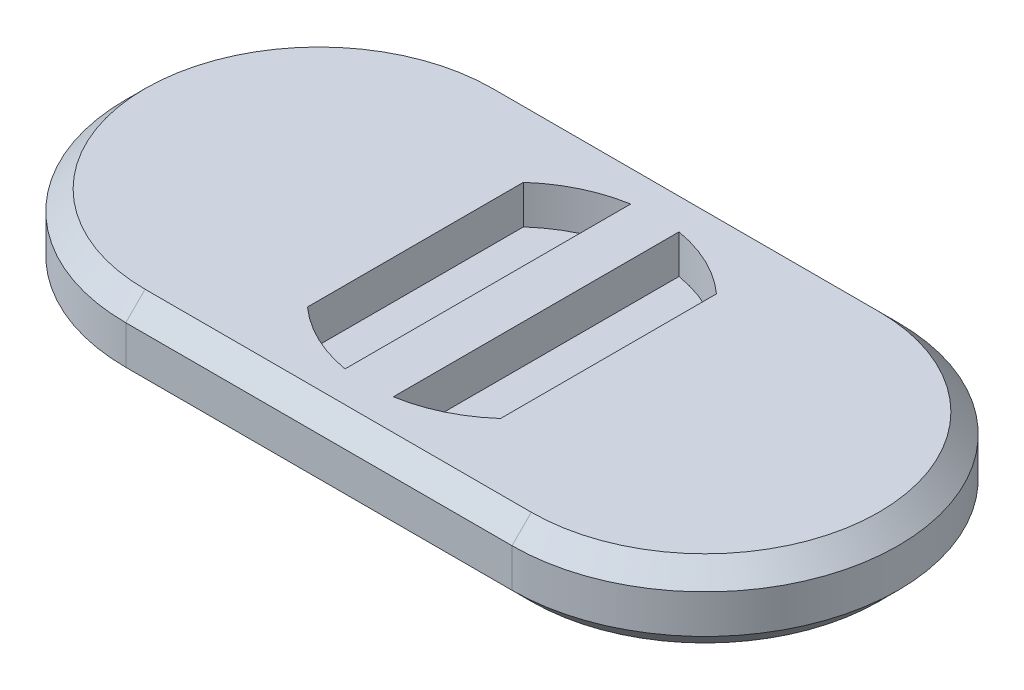
ISO-10303-21;
HEADER;
FILE_DESCRIPTION(('STEP AP214'),'2;1');
FILE_NAME('part.step','',(''),(''),'','','');
FILE_SCHEMA(('AUTOMOTIVE_DESIGN { 1 0 10303 214 1 1 1 1 }'));
ENDSEC;
DATA;
#1=APPLICATION_CONTEXT('core data for automotive mechanical design processes');
#2=APPLICATION_PROTOCOL_DEFINITION('international standard','automotive_design',2000,#1);
#3=PRODUCT_CONTEXT('',#1,'mechanical');
#4=PRODUCT('Part','Part','',(#3));
#5=PRODUCT_RELATED_PRODUCT_CATEGORY('part','',(#4));
#6=PRODUCT_DEFINITION_FORMATION('','',#4);
#7=PRODUCT_DEFINITION_CONTEXT('part definition',#1,'design');
#8=PRODUCT_DEFINITION('design','',#6,#7);
#9=PRODUCT_DEFINITION_SHAPE('','',#8);
#10=(LENGTH_UNIT() NAMED_UNIT(*) SI_UNIT(.MILLI.,.METRE.));
#11=(NAMED_UNIT(*) PLANE_ANGLE_UNIT() SI_UNIT($,.RADIAN.));
#12=(NAMED_UNIT(*) SI_UNIT($,.STERADIAN.) SOLID_ANGLE_UNIT());
#13=UNCERTAINTY_MEASURE_WITH_UNIT(LENGTH_MEASURE(1.E-05),#10,'distance_accuracy_value','');
#14=(GEOMETRIC_REPRESENTATION_CONTEXT(3) GLOBAL_UNCERTAINTY_ASSIGNED_CONTEXT((#13)) GLOBAL_UNIT_ASSIGNED_CONTEXT((#10,
#11,#12)) REPRESENTATION_CONTEXT('',''));
#15=CARTESIAN_POINT('',(0.,0.,0.));
#16=DIRECTION('',(0.,0.,1.));
#17=DIRECTION('',(1.,0.,0.));
#18=AXIS2_PLACEMENT_3D('',#15,#16,#17);
#19=CARTESIAN_POINT('',(-20.,8.,0.));
#20=DIRECTION('',(0.,-1.,0.));
#21=DIRECTION('',(0.,0.,-1.));
#22=AXIS2_PLACEMENT_3D('',#19,#20,#21);
#23=CYLINDRICAL_SURFACE('',#22,20.);
#24=DIRECTION('',(0.,-1.,0.));
#25=VECTOR('',#24,1.);
#26=CARTESIAN_POINT('',(-20.,8.,20.));
#27=LINE('',#26,#25);
#28=CARTESIAN_POINT('',(-20.,5.99999999999998,20.));
#29=VERTEX_POINT('',#28);
#30=CARTESIAN_POINT('',(-20.,2.00000000000001,20.));
#31=VERTEX_POINT('',#30);
#32=EDGE_CURVE('E275',#29,#31,#27,.T.);
#33=ORIENTED_EDGE('',*,*,#32,.F.);
#34=CARTESIAN_POINT('',(-20.,5.99999999999998,0.));
#35=DIRECTION('',(0.,1.,0.));
#36=DIRECTION('',(0.,0.,1.));
#37=AXIS2_PLACEMENT_3D('',#34,#35,#36);
#38=CIRCLE('',#37,20.);
#39=CARTESIAN_POINT('',(-20.,5.99999999999998,-20.));
#40=VERTEX_POINT('',#39);
#41=EDGE_CURVE('E296',#29,#40,#38,.F.);
#42=ORIENTED_EDGE('',*,*,#41,.T.);
#43=DIRECTION('',(0.,-1.,0.));
#44=VECTOR('',#43,1.);
#45=CARTESIAN_POINT('',(-20.,8.,-20.));
#46=LINE('',#45,#44);
#47=CARTESIAN_POINT('',(-20.,2.00000000000001,-20.));
#48=VERTEX_POINT('',#47);
#49=EDGE_CURVE('E214',#40,#48,#46,.T.);
#50=ORIENTED_EDGE('',*,*,#49,.T.);
#51=CARTESIAN_POINT('',(-20.,2.00000000000001,0.));
#52=DIRECTION('',(0.,1.,0.));
#53=DIRECTION('',(0.,0.,1.));
#54=AXIS2_PLACEMENT_3D('',#51,#52,#53);
#55=CIRCLE('',#54,20.);
#56=EDGE_CURVE('E292',#48,#31,#55,.T.);
#57=ORIENTED_EDGE('',*,*,#56,.T.);
#58=EDGE_LOOP('',(#33,#42,#50,#57));
#59=FACE_BOUND('',#58,.T.);
#60=ADVANCED_FACE('F47',(#59),#23,.T.);
#61=CARTESIAN_POINT('',(-20.,8.,20.));
#62=DIRECTION('',(0.,0.,-1.));
#63=DIRECTION('',(-1.,0.,0.));
#64=AXIS2_PLACEMENT_3D('',#61,#62,#63);
#65=PLANE('',#64);
#66=DIRECTION('',(0.,-1.,0.));
#67=VECTOR('',#66,1.);
#68=CARTESIAN_POINT('',(20.,8.,20.));
#69=LINE('',#68,#67);
#70=CARTESIAN_POINT('',(20.,5.99999999999998,20.));
#71=VERTEX_POINT('',#70);
#72=CARTESIAN_POINT('',(20.,2.00000000000001,20.));
#73=VERTEX_POINT('',#72);
#74=EDGE_CURVE('E271',#71,#73,#69,.T.);
#75=ORIENTED_EDGE('',*,*,#74,.F.);
#76=DIRECTION('',(-1.,0.,0.));
#77=VECTOR('',#76,1.);
#78=CARTESIAN_POINT('',(-20.,5.99999999999998,20.));
#79=LINE('',#78,#77);
#80=EDGE_CURVE('E303',#71,#29,#79,.T.);
#81=ORIENTED_EDGE('',*,*,#80,.T.);
#82=ORIENTED_EDGE('',*,*,#32,.T.);
#83=DIRECTION('',(1.,0.,0.));
#84=VECTOR('',#83,1.);
#85=CARTESIAN_POINT('',(-20.,2.00000000000001,20.));
#86=LINE('',#85,#84);
#87=EDGE_CURVE('E300',#31,#73,#86,.T.);
#88=ORIENTED_EDGE('',*,*,#87,.T.);
#89=EDGE_LOOP('',(#75,#81,#82,#88));
#90=FACE_BOUND('',#89,.T.);
#91=ADVANCED_FACE('F368',(#90),#65,.F.);
#92=CARTESIAN_POINT('',(20.,8.,0.));
#93=DIRECTION('',(0.,-1.,0.));
#94=DIRECTION('',(0.,0.,-1.));
#95=AXIS2_PLACEMENT_3D('',#92,#93,#94);
#96=CYLINDRICAL_SURFACE('',#95,20.);
#97=DIRECTION('',(0.,-1.,0.));
#98=VECTOR('',#97,1.);
#99=CARTESIAN_POINT('',(20.,8.,-20.));
#100=LINE('',#99,#98);
#101=CARTESIAN_POINT('',(20.,5.99999999999998,-20.));
#102=VERTEX_POINT('',#101);
#103=CARTESIAN_POINT('',(20.,2.00000000000001,-20.));
#104=VERTEX_POINT('',#103);
#105=EDGE_CURVE('E267',#102,#104,#100,.T.);
#106=ORIENTED_EDGE('',*,*,#105,.F.);
#107=CARTESIAN_POINT('',(20.,5.99999999999998,0.));
#108=DIRECTION('',(0.,1.,0.));
#109=DIRECTION('',(0.,0.,1.));
#110=AXIS2_PLACEMENT_3D('',#107,#108,#109);
#111=CIRCLE('',#110,20.);
#112=EDGE_CURVE('E315',#102,#71,#111,.F.);
#113=ORIENTED_EDGE('',*,*,#112,.T.);
#114=ORIENTED_EDGE('',*,*,#74,.T.);
#115=CARTESIAN_POINT('',(20.,2.00000000000001,0.));
#116=DIRECTION('',(0.,1.,0.));
#117=DIRECTION('',(0.,0.,1.));
#118=AXIS2_PLACEMENT_3D('',#115,#116,#117);
#119=CIRCLE('',#118,20.);
#120=EDGE_CURVE('E312',#73,#104,#119,.T.);
#121=ORIENTED_EDGE('',*,*,#120,.T.);
#122=EDGE_LOOP('',(#106,#113,#114,#121));
#123=FACE_BOUND('',#122,.T.);
#124=ADVANCED_FACE('F385',(#123),#96,.T.);
#125=CARTESIAN_POINT('',(-20.,8.,-20.));
#126=DIRECTION('',(0.,0.,1.));
#127=DIRECTION('',(1.,0.,0.));
#128=AXIS2_PLACEMENT_3D('',#125,#126,#127);
#129=PLANE('',#128);
#130=ORIENTED_EDGE('',*,*,#49,.F.);
#131=DIRECTION('',(1.,0.,0.));
#132=VECTOR('',#131,1.);
#133=CARTESIAN_POINT('',(20.,5.99999999999998,-20.));
#134=LINE('',#133,#132);
#135=EDGE_CURVE('E309',#40,#102,#134,.T.);
#136=ORIENTED_EDGE('',*,*,#135,.T.);
#137=ORIENTED_EDGE('',*,*,#105,.T.);
#138=DIRECTION('',(-1.,0.,0.));
#139=VECTOR('',#138,1.);
#140=CARTESIAN_POINT('',(-20.,2.00000000000001,-20.));
#141=LINE('',#140,#139);
#142=EDGE_CURVE('E306',#104,#48,#141,.T.);
#143=ORIENTED_EDGE('',*,*,#142,.T.);
#144=EDGE_LOOP('',(#130,#136,#137,#143));
#145=FACE_BOUND('',#144,.T.);
#146=ADVANCED_FACE('F381',(#145),#129,.F.);
#147=CARTESIAN_POINT('',(-20.,8.,0.));
#148=DIRECTION('',(0.,1.,0.));
#149=DIRECTION('',(0.,0.,1.));
#150=AXIS2_PLACEMENT_3D('',#147,#148,#149);
#151=PLANE('',#150);
#152=DIRECTION('',(-1.,0.,0.));
#153=VECTOR('',#152,1.);
#154=CARTESIAN_POINT('',(-20.,8.,-18.));
#155=LINE('',#154,#153);
#156=CARTESIAN_POINT('',(20.,8.,-18.));
#157=VERTEX_POINT('',#156);
#158=CARTESIAN_POINT('',(-20.,8.,-18.));
#159=VERTEX_POINT('',#158);
#160=EDGE_CURVE('E282',#157,#159,#155,.T.);
#161=ORIENTED_EDGE('',*,*,#160,.T.);
#162=CARTESIAN_POINT('',(-20.,8.,0.));
#163=DIRECTION('',(0.,1.,0.));
#164=DIRECTION('',(0.,0.,1.));
#165=AXIS2_PLACEMENT_3D('',#162,#163,#164);
#166=CIRCLE('',#165,18.);
#167=CARTESIAN_POINT('',(-20.,8.,18.));
#168=VERTEX_POINT('',#167);
#169=EDGE_CURVE('E288',#159,#168,#166,.T.);
#170=ORIENTED_EDGE('',*,*,#169,.T.);
#171=DIRECTION('',(1.,0.,0.));
#172=VECTOR('',#171,1.);
#173=CARTESIAN_POINT('',(20.,8.,18.));
#174=LINE('',#173,#172);
#175=CARTESIAN_POINT('',(20.,8.,18.));
#176=VERTEX_POINT('',#175);
#177=EDGE_CURVE('E285',#168,#176,#174,.T.);
#178=ORIENTED_EDGE('',*,*,#177,.T.);
#179=CARTESIAN_POINT('',(20.,8.,0.));
#180=DIRECTION('',(0.,1.,0.));
#181=DIRECTION('',(0.,0.,1.));
#182=AXIS2_PLACEMENT_3D('',#179,#180,#181);
#183=CIRCLE('',#182,18.);
#184=EDGE_CURVE('E279',#176,#157,#183,.T.);
#185=ORIENTED_EDGE('',*,*,#184,.T.);
#186=EDGE_LOOP('',(#161,#170,#178,#185));
#187=FACE_BOUND('',#186,.T.);
#188=CARTESIAN_POINT('',(0.,8.,0.));
#189=DIRECTION('',(0.,1.,0.));
#190=DIRECTION('',(0.,0.,1.));
#191=AXIS2_PLACEMENT_3D('',#188,#189,#190);
#192=CIRCLE('',#191,15.);
#193=CARTESIAN_POINT('',(10.,8.,-11.1803398874989));
#194=VERTEX_POINT('',#193);
#195=CARTESIAN_POINT('',(2.5,8.,-14.790199457749));
#196=VERTEX_POINT('',#195);
#197=EDGE_CURVE('E171',#194,#196,#192,.T.);
#198=ORIENTED_EDGE('',*,*,#197,.F.);
#199=DIRECTION('',(0.,0.,-1.));
#200=VECTOR('',#199,1.);
#201=CARTESIAN_POINT('',(10.,8.,11.1803398874989));
#202=LINE('',#201,#200);
#203=CARTESIAN_POINT('',(10.,8.,11.1803398874989));
#204=VERTEX_POINT('',#203);
#205=EDGE_CURVE('E191',#204,#194,#202,.T.);
#206=ORIENTED_EDGE('',*,*,#205,.F.);
#207=CARTESIAN_POINT('',(0.,8.,0.));
#208=DIRECTION('',(0.,1.,0.));
#209=DIRECTION('',(0.,0.,1.));
#210=AXIS2_PLACEMENT_3D('',#207,#208,#209);
#211=CIRCLE('',#210,15.);
#212=CARTESIAN_POINT('',(2.5,8.,14.790199457749));
#213=VERTEX_POINT('',#212);
#214=EDGE_CURVE('E195',#213,#204,#211,.T.);
#215=ORIENTED_EDGE('',*,*,#214,.F.);
#216=DIRECTION('',(0.,0.,1.));
#217=VECTOR('',#216,1.);
#218=CARTESIAN_POINT('',(2.5,8.,-14.790199457749));
#219=LINE('',#218,#217);
#220=EDGE_CURVE('E204',#196,#213,#219,.T.);
#221=ORIENTED_EDGE('',*,*,#220,.F.);
#222=EDGE_LOOP('',(#198,#206,#215,#221));
#223=FACE_BOUND('',#222,.T.);
#224=CARTESIAN_POINT('',(0.,8.,0.));
#225=DIRECTION('',(0.,1.,0.));
#226=DIRECTION('',(0.,0.,1.));
#227=AXIS2_PLACEMENT_3D('',#224,#225,#226);
#228=CIRCLE('',#227,15.);
#229=CARTESIAN_POINT('',(-10.,8.,11.1803398874989));
#230=VERTEX_POINT('',#229);
#231=CARTESIAN_POINT('',(-2.5,8.,14.790199457749));
#232=VERTEX_POINT('',#231);
#233=EDGE_CURVE('E205',#230,#232,#228,.T.);
#234=ORIENTED_EDGE('',*,*,#233,.F.);
#235=DIRECTION('',(0.,0.,1.));
#236=VECTOR('',#235,1.);
#237=CARTESIAN_POINT('',(-10.,8.,11.1803398874989));
#238=LINE('',#237,#236);
#239=CARTESIAN_POINT('',(-10.,8.,-11.1803398874989));
#240=VERTEX_POINT('',#239);
#241=EDGE_CURVE('E235',#240,#230,#238,.T.);
#242=ORIENTED_EDGE('',*,*,#241,.F.);
#243=CARTESIAN_POINT('',(0.,8.,0.));
#244=DIRECTION('',(0.,1.,0.));
#245=DIRECTION('',(0.,0.,1.));
#246=AXIS2_PLACEMENT_3D('',#243,#244,#245);
#247=CIRCLE('',#246,15.);
#248=CARTESIAN_POINT('',(-2.5,8.,-14.790199457749));
#249=VERTEX_POINT('',#248);
#250=EDGE_CURVE('E239',#249,#240,#247,.T.);
#251=ORIENTED_EDGE('',*,*,#250,.F.);
#252=DIRECTION('',(0.,0.,-1.));
#253=VECTOR('',#252,1.);
#254=CARTESIAN_POINT('',(-2.5,8.,-14.790199457749));
#255=LINE('',#254,#253);
#256=EDGE_CURVE('E244',#232,#249,#255,.T.);
#257=ORIENTED_EDGE('',*,*,#256,.F.);
#258=EDGE_LOOP('',(#234,#242,#251,#257));
#259=FACE_BOUND('',#258,.T.);
#260=ADVANCED_FACE('F394',(#187,#223,#259),#151,.T.);
#261=CARTESIAN_POINT('',(-20.,0.,0.));
#262=DIRECTION('',(0.,1.,0.));
#263=DIRECTION('',(0.,0.,1.));
#264=AXIS2_PLACEMENT_3D('',#261,#262,#263);
#265=PLANE('',#264);
#266=DIRECTION('',(-1.,0.,0.));
#267=VECTOR('',#266,1.);
#268=CARTESIAN_POINT('',(-20.,0.,18.));
#269=LINE('',#268,#267);
#270=CARTESIAN_POINT('',(20.,0.,18.));
#271=VERTEX_POINT('',#270);
#272=CARTESIAN_POINT('',(-20.,0.,18.));
#273=VERTEX_POINT('',#272);
#274=EDGE_CURVE('E58',#271,#273,#269,.T.);
#275=ORIENTED_EDGE('',*,*,#274,.T.);
#276=CARTESIAN_POINT('',(-20.,0.,0.));
#277=DIRECTION('',(0.,1.,0.));
#278=DIRECTION('',(0.,0.,1.));
#279=AXIS2_PLACEMENT_3D('',#276,#277,#278);
#280=CIRCLE('',#279,18.);
#281=CARTESIAN_POINT('',(-20.,0.,-18.));
#282=VERTEX_POINT('',#281);
#283=EDGE_CURVE('E11',#273,#282,#280,.F.);
#284=ORIENTED_EDGE('',*,*,#283,.T.);
#285=DIRECTION('',(1.,0.,0.));
#286=VECTOR('',#285,1.);
#287=CARTESIAN_POINT('',(-20.,0.,-18.));
#288=LINE('',#287,#286);
#289=CARTESIAN_POINT('',(20.,0.,-18.));
#290=VERTEX_POINT('',#289);
#291=EDGE_CURVE('E321',#282,#290,#288,.T.);
#292=ORIENTED_EDGE('',*,*,#291,.T.);
#293=CARTESIAN_POINT('',(20.,0.,0.));
#294=DIRECTION('',(0.,1.,0.));
#295=DIRECTION('',(0.,0.,1.));
#296=AXIS2_PLACEMENT_3D('',#293,#294,#295);
#297=CIRCLE('',#296,18.);
#298=EDGE_CURVE('E318',#290,#271,#297,.F.);
#299=ORIENTED_EDGE('',*,*,#298,.T.);
#300=EDGE_LOOP('',(#275,#284,#292,#299));
#301=FACE_BOUND('',#300,.T.);
#302=ADVANCED_FACE('F358',(#301),#265,.F.);
#303=CARTESIAN_POINT('',(0.,4.,0.));
#304=DIRECTION('',(0.,1.,0.));
#305=DIRECTION('',(0.,0.,1.));
#306=AXIS2_PLACEMENT_3D('',#303,#304,#305);
#307=CYLINDRICAL_SURFACE('',#306,15.);
#308=ORIENTED_EDGE('',*,*,#233,.T.);
#309=DIRECTION('',(0.,1.,0.));
#310=VECTOR('',#309,1.);
#311=CARTESIAN_POINT('',(-2.5,4.,14.790199457749));
#312=LINE('',#311,#310);
#313=CARTESIAN_POINT('',(-2.5,4.,14.790199457749));
#314=VERTEX_POINT('',#313);
#315=EDGE_CURVE('E220',#314,#232,#312,.T.);
#316=ORIENTED_EDGE('',*,*,#315,.F.);
#317=CARTESIAN_POINT('',(0.,4.,0.));
#318=DIRECTION('',(0.,1.,0.));
#319=DIRECTION('',(0.,0.,1.));
#320=AXIS2_PLACEMENT_3D('',#317,#318,#319);
#321=CIRCLE('',#320,15.);
#322=CARTESIAN_POINT('',(-10.,4.,11.1803398874989));
#323=VERTEX_POINT('',#322);
#324=EDGE_CURVE('E240',#323,#314,#321,.T.);
#325=ORIENTED_EDGE('',*,*,#324,.F.);
#326=DIRECTION('',(0.,1.,0.));
#327=VECTOR('',#326,1.);
#328=CARTESIAN_POINT('',(-10.,4.,11.1803398874989));
#329=LINE('',#328,#327);
#330=EDGE_CURVE('E231',#323,#230,#329,.T.);
#331=ORIENTED_EDGE('',*,*,#330,.T.);
#332=EDGE_LOOP('',(#308,#316,#325,#331));
#333=FACE_BOUND('',#332,.T.);
#334=ADVANCED_FACE('F405',(#333),#307,.F.);
#335=CARTESIAN_POINT('',(-10.,4.,11.1803398874989));
#336=DIRECTION('',(-1.,0.,0.));
#337=DIRECTION('',(0.,0.,1.));
#338=AXIS2_PLACEMENT_3D('',#335,#336,#337);
#339=PLANE('',#338);
#340=ORIENTED_EDGE('',*,*,#241,.T.);
#341=ORIENTED_EDGE('',*,*,#330,.F.);
#342=DIRECTION('',(0.,0.,1.));
#343=VECTOR('',#342,1.);
#344=CARTESIAN_POINT('',(-10.,4.,11.1803398874989));
#345=LINE('',#344,#343);
#346=CARTESIAN_POINT('',(-10.,4.,-11.1803398874989));
#347=VERTEX_POINT('',#346);
#348=EDGE_CURVE('E224',#347,#323,#345,.T.);
#349=ORIENTED_EDGE('',*,*,#348,.F.);
#350=DIRECTION('',(0.,1.,0.));
#351=VECTOR('',#350,1.);
#352=CARTESIAN_POINT('',(-10.,4.,-11.1803398874989));
#353=LINE('',#352,#351);
#354=EDGE_CURVE('E228',#347,#240,#353,.T.);
#355=ORIENTED_EDGE('',*,*,#354,.T.);
#356=EDGE_LOOP('',(#340,#341,#349,#355));
#357=FACE_BOUND('',#356,.T.);
#358=ADVANCED_FACE('F415',(#357),#339,.F.);
#359=CARTESIAN_POINT('',(0.,4.,0.));
#360=DIRECTION('',(0.,1.,0.));
#361=DIRECTION('',(0.,0.,1.));
#362=AXIS2_PLACEMENT_3D('',#359,#360,#361);
#363=CYLINDRICAL_SURFACE('',#362,15.);
#364=ORIENTED_EDGE('',*,*,#250,.T.);
#365=ORIENTED_EDGE('',*,*,#354,.F.);
#366=CARTESIAN_POINT('',(0.,4.,0.));
#367=DIRECTION('',(0.,1.,0.));
#368=DIRECTION('',(0.,0.,1.));
#369=AXIS2_PLACEMENT_3D('',#366,#367,#368);
#370=CIRCLE('',#369,15.);
#371=CARTESIAN_POINT('',(-2.5,4.,-14.790199457749));
#372=VERTEX_POINT('',#371);
#373=EDGE_CURVE('E253',#372,#347,#370,.T.);
#374=ORIENTED_EDGE('',*,*,#373,.F.);
#375=DIRECTION('',(0.,1.,0.));
#376=VECTOR('',#375,1.);
#377=CARTESIAN_POINT('',(-2.5,4.,-14.790199457749));
#378=LINE('',#377,#376);
#379=EDGE_CURVE('E225',#372,#249,#378,.T.);
#380=ORIENTED_EDGE('',*,*,#379,.T.);
#381=EDGE_LOOP('',(#364,#365,#374,#380));
#382=FACE_BOUND('',#381,.T.);
#383=ADVANCED_FACE('F417',(#382),#363,.F.);
#384=CARTESIAN_POINT('',(-2.5,4.,-14.790199457749));
#385=DIRECTION('',(1.,0.,0.));
#386=DIRECTION('',(0.,0.,-1.));
#387=AXIS2_PLACEMENT_3D('',#384,#385,#386);
#388=PLANE('',#387);
#389=ORIENTED_EDGE('',*,*,#256,.T.);
#390=ORIENTED_EDGE('',*,*,#379,.F.);
#391=DIRECTION('',(0.,0.,-1.));
#392=VECTOR('',#391,1.);
#393=CARTESIAN_POINT('',(-2.5,4.,-14.790199457749));
#394=LINE('',#393,#392);
#395=EDGE_CURVE('E257',#314,#372,#394,.T.);
#396=ORIENTED_EDGE('',*,*,#395,.F.);
#397=ORIENTED_EDGE('',*,*,#315,.T.);
#398=EDGE_LOOP('',(#389,#390,#396,#397));
#399=FACE_BOUND('',#398,.T.);
#400=ADVANCED_FACE('F409',(#399),#388,.F.);
#401=CARTESIAN_POINT('',(0.,4.,0.));
#402=DIRECTION('',(0.,1.,0.));
#403=DIRECTION('',(0.,0.,1.));
#404=AXIS2_PLACEMENT_3D('',#401,#402,#403);
#405=PLANE('',#404);
#406=ORIENTED_EDGE('',*,*,#324,.T.);
#407=ORIENTED_EDGE('',*,*,#395,.T.);
#408=ORIENTED_EDGE('',*,*,#373,.T.);
#409=ORIENTED_EDGE('',*,*,#348,.T.);
#410=EDGE_LOOP('',(#406,#407,#408,#409));
#411=FACE_BOUND('',#410,.T.);
#412=ADVANCED_FACE('F412',(#411),#405,.T.);
#413=CARTESIAN_POINT('',(0.,4.,0.));
#414=DIRECTION('',(0.,1.,0.));
#415=DIRECTION('',(0.,0.,1.));
#416=AXIS2_PLACEMENT_3D('',#413,#414,#415);
#417=CYLINDRICAL_SURFACE('',#416,15.);
#418=ORIENTED_EDGE('',*,*,#197,.T.);
#419=DIRECTION('',(0.,1.,0.));
#420=VECTOR('',#419,1.);
#421=CARTESIAN_POINT('',(2.5,4.,-14.790199457749));
#422=LINE('',#421,#420);
#423=CARTESIAN_POINT('',(2.5,4.,-14.790199457749));
#424=VERTEX_POINT('',#423);
#425=EDGE_CURVE('E164',#424,#196,#422,.T.);
#426=ORIENTED_EDGE('',*,*,#425,.F.);
#427=CARTESIAN_POINT('',(0.,4.,0.));
#428=DIRECTION('',(0.,1.,0.));
#429=DIRECTION('',(0.,0.,1.));
#430=AXIS2_PLACEMENT_3D('',#427,#428,#429);
#431=CIRCLE('',#430,15.);
#432=CARTESIAN_POINT('',(10.,4.,-11.1803398874989));
#433=VERTEX_POINT('',#432);
#434=EDGE_CURVE('E168',#433,#424,#431,.T.);
#435=ORIENTED_EDGE('',*,*,#434,.F.);
#436=DIRECTION('',(0.,1.,0.));
#437=VECTOR('',#436,1.);
#438=CARTESIAN_POINT('',(10.,4.,-11.1803398874989));
#439=LINE('',#438,#437);
#440=EDGE_CURVE('E211',#433,#194,#439,.T.);
#441=ORIENTED_EDGE('',*,*,#440,.T.);
#442=EDGE_LOOP('',(#418,#426,#435,#441));
#443=FACE_BOUND('',#442,.T.);
#444=ADVANCED_FACE('F166',(#443),#417,.F.);
#445=CARTESIAN_POINT('',(10.,4.,11.1803398874989));
#446=DIRECTION('',(1.,0.,0.));
#447=DIRECTION('',(0.,0.,-1.));
#448=AXIS2_PLACEMENT_3D('',#445,#446,#447);
#449=PLANE('',#448);
#450=ORIENTED_EDGE('',*,*,#205,.T.);
#451=ORIENTED_EDGE('',*,*,#440,.F.);
#452=DIRECTION('',(0.,0.,-1.));
#453=VECTOR('',#452,1.);
#454=CARTESIAN_POINT('',(10.,4.,11.1803398874989));
#455=LINE('',#454,#453);
#456=CARTESIAN_POINT('',(10.,4.,11.1803398874989));
#457=VERTEX_POINT('',#456);
#458=EDGE_CURVE('E177',#457,#433,#455,.T.);
#459=ORIENTED_EDGE('',*,*,#458,.F.);
#460=DIRECTION('',(0.,1.,0.));
#461=VECTOR('',#460,1.);
#462=CARTESIAN_POINT('',(10.,4.,11.1803398874989));
#463=LINE('',#462,#461);
#464=EDGE_CURVE('E215',#457,#204,#463,.T.);
#465=ORIENTED_EDGE('',*,*,#464,.T.);
#466=EDGE_LOOP('',(#450,#451,#459,#465));
#467=FACE_BOUND('',#466,.T.);
#468=ADVANCED_FACE('F507',(#467),#449,.F.);
#469=CARTESIAN_POINT('',(0.,4.,0.));
#470=DIRECTION('',(0.,1.,0.));
#471=DIRECTION('',(0.,0.,1.));
#472=AXIS2_PLACEMENT_3D('',#469,#470,#471);
#473=CYLINDRICAL_SURFACE('',#472,15.);
#474=ORIENTED_EDGE('',*,*,#214,.T.);
#475=ORIENTED_EDGE('',*,*,#464,.F.);
#476=CARTESIAN_POINT('',(0.,4.,0.));
#477=DIRECTION('',(0.,1.,0.));
#478=DIRECTION('',(0.,0.,1.));
#479=AXIS2_PLACEMENT_3D('',#476,#477,#478);
#480=CIRCLE('',#479,15.);
#481=CARTESIAN_POINT('',(2.5,4.,14.790199457749));
#482=VERTEX_POINT('',#481);
#483=EDGE_CURVE('E186',#482,#457,#480,.T.);
#484=ORIENTED_EDGE('',*,*,#483,.F.);
#485=DIRECTION('',(0.,1.,0.));
#486=VECTOR('',#485,1.);
#487=CARTESIAN_POINT('',(2.5,4.,14.790199457749));
#488=LINE('',#487,#486);
#489=EDGE_CURVE('E176',#482,#213,#488,.T.);
#490=ORIENTED_EDGE('',*,*,#489,.T.);
#491=EDGE_LOOP('',(#474,#475,#484,#490));
#492=FACE_BOUND('',#491,.T.);
#493=ADVANCED_FACE('F500',(#492),#473,.F.);
#494=CARTESIAN_POINT('',(2.5,4.,-14.790199457749));
#495=DIRECTION('',(-1.,0.,0.));
#496=DIRECTION('',(0.,0.,1.));
#497=AXIS2_PLACEMENT_3D('',#494,#495,#496);
#498=PLANE('',#497);
#499=ORIENTED_EDGE('',*,*,#220,.T.);
#500=ORIENTED_EDGE('',*,*,#489,.F.);
#501=DIRECTION('',(0.,0.,1.));
#502=VECTOR('',#501,1.);
#503=CARTESIAN_POINT('',(2.5,4.,-14.790199457749));
#504=LINE('',#503,#502);
#505=EDGE_CURVE('E180',#424,#482,#504,.T.);
#506=ORIENTED_EDGE('',*,*,#505,.F.);
#507=ORIENTED_EDGE('',*,*,#425,.T.);
#508=EDGE_LOOP('',(#499,#500,#506,#507));
#509=FACE_BOUND('',#508,.T.);
#510=ADVANCED_FACE('F181',(#509),#498,.F.);
#511=CARTESIAN_POINT('',(0.,4.,0.));
#512=DIRECTION('',(0.,1.,0.));
#513=DIRECTION('',(0.,0.,1.));
#514=AXIS2_PLACEMENT_3D('',#511,#512,#513);
#515=PLANE('',#514);
#516=ORIENTED_EDGE('',*,*,#434,.T.);
#517=ORIENTED_EDGE('',*,*,#505,.T.);
#518=ORIENTED_EDGE('',*,*,#483,.T.);
#519=ORIENTED_EDGE('',*,*,#458,.T.);
#520=EDGE_LOOP('',(#516,#517,#518,#519));
#521=FACE_BOUND('',#520,.T.);
#522=ADVANCED_FACE('F188',(#521),#515,.T.);
#523=CARTESIAN_POINT('',(20.,8.,0.));
#524=DIRECTION('',(0.,-1.,0.));
#525=DIRECTION('',(0.,0.,-1.));
#526=AXIS2_PLACEMENT_3D('',#523,#524,#525);
#527=CONICAL_SURFACE('',#526,18.,0.785398163397448);
#528=DIRECTION('',(0.,0.707106781186547,-0.707106781186547));
#529=VECTOR('',#528,1.);
#530=CARTESIAN_POINT('',(20.,5.99999999999998,20.));
#531=LINE('',#530,#529);
#532=EDGE_CURVE('E332',#71,#176,#531,.T.);
#533=ORIENTED_EDGE('',*,*,#532,.F.);
#534=ORIENTED_EDGE('',*,*,#112,.F.);
#535=DIRECTION('',(0.,-0.707106781186547,-0.707106781186547));
#536=VECTOR('',#535,1.);
#537=CARTESIAN_POINT('',(20.,8.,-18.));
#538=LINE('',#537,#536);
#539=EDGE_CURVE('E234',#157,#102,#538,.T.);
#540=ORIENTED_EDGE('',*,*,#539,.F.);
#541=ORIENTED_EDGE('',*,*,#184,.F.);
#542=EDGE_LOOP('',(#533,#534,#540,#541));
#543=FACE_BOUND('',#542,.T.);
#544=ADVANCED_FACE('F388',(#543),#527,.T.);
#545=CARTESIAN_POINT('',(-20.,8.,-18.));
#546=DIRECTION('',(0.,0.707106781186547,-0.707106781186547));
#547=DIRECTION('',(1.,0.,0.));
#548=AXIS2_PLACEMENT_3D('',#545,#546,#547);
#549=PLANE('',#548);
#550=ORIENTED_EDGE('',*,*,#539,.T.);
#551=ORIENTED_EDGE('',*,*,#135,.F.);
#552=DIRECTION('',(0.,-0.707106781186547,-0.707106781186547));
#553=VECTOR('',#552,1.);
#554=CARTESIAN_POINT('',(-20.,8.,-18.));
#555=LINE('',#554,#553);
#556=EDGE_CURVE('E329',#159,#40,#555,.T.);
#557=ORIENTED_EDGE('',*,*,#556,.F.);
#558=ORIENTED_EDGE('',*,*,#160,.F.);
#559=EDGE_LOOP('',(#550,#551,#557,#558));
#560=FACE_BOUND('',#559,.T.);
#561=ADVANCED_FACE('F392',(#560),#549,.T.);
#562=CARTESIAN_POINT('',(-20.,8.,18.));
#563=DIRECTION('',(0.,0.707106781186547,0.707106781186547));
#564=DIRECTION('',(-1.,0.,0.));
#565=AXIS2_PLACEMENT_3D('',#562,#563,#564);
#566=PLANE('',#565);
#567=ORIENTED_EDGE('',*,*,#532,.T.);
#568=ORIENTED_EDGE('',*,*,#177,.F.);
#569=DIRECTION('',(0.,0.707106781186547,-0.707106781186547));
#570=VECTOR('',#569,1.);
#571=CARTESIAN_POINT('',(-20.,5.99999999999998,20.));
#572=LINE('',#571,#570);
#573=EDGE_CURVE('E326',#29,#168,#572,.T.);
#574=ORIENTED_EDGE('',*,*,#573,.F.);
#575=ORIENTED_EDGE('',*,*,#80,.F.);
#576=EDGE_LOOP('',(#567,#568,#574,#575));
#577=FACE_BOUND('',#576,.T.);
#578=ADVANCED_FACE('F373',(#577),#566,.T.);
#579=CARTESIAN_POINT('',(-20.,8.,0.));
#580=DIRECTION('',(0.,-1.,0.));
#581=DIRECTION('',(0.,0.,-1.));
#582=AXIS2_PLACEMENT_3D('',#579,#580,#581);
#583=CONICAL_SURFACE('',#582,18.,0.785398163397448);
#584=ORIENTED_EDGE('',*,*,#556,.T.);
#585=ORIENTED_EDGE('',*,*,#41,.F.);
#586=ORIENTED_EDGE('',*,*,#573,.T.);
#587=ORIENTED_EDGE('',*,*,#169,.F.);
#588=EDGE_LOOP('',(#584,#585,#586,#587));
#589=FACE_BOUND('',#588,.T.);
#590=ADVANCED_FACE('F377',(#589),#583,.T.);
#591=CARTESIAN_POINT('',(20.,2.00000000000001,0.));
#592=DIRECTION('',(0.,1.,0.));
#593=DIRECTION('',(0.,0.,1.));
#594=AXIS2_PLACEMENT_3D('',#591,#592,#593);
#595=CONICAL_SURFACE('',#594,20.,0.78539816339745);
#596=DIRECTION('',(0.,0.707106781186546,0.707106781186549));
#597=VECTOR('',#596,1.);
#598=CARTESIAN_POINT('',(20.,0.,18.));
#599=LINE('',#598,#597);
#600=EDGE_CURVE('E343',#271,#73,#599,.T.);
#601=ORIENTED_EDGE('',*,*,#600,.F.);
#602=ORIENTED_EDGE('',*,*,#298,.F.);
#603=DIRECTION('',(0.,-0.707106781186546,0.707106781186549));
#604=VECTOR('',#603,1.);
#605=CARTESIAN_POINT('',(20.,2.00000000000001,-20.));
#606=LINE('',#605,#604);
#607=EDGE_CURVE('E52',#104,#290,#606,.T.);
#608=ORIENTED_EDGE('',*,*,#607,.F.);
#609=ORIENTED_EDGE('',*,*,#120,.F.);
#610=EDGE_LOOP('',(#601,#602,#608,#609));
#611=FACE_BOUND('',#610,.T.);
#612=ADVANCED_FACE('F50',(#611),#595,.T.);
#613=CARTESIAN_POINT('',(-20.,2.00000000000001,-20.));
#614=DIRECTION('',(0.,0.707106781186549,0.707106781186546));
#615=DIRECTION('',(-1.,0.,0.));
#616=AXIS2_PLACEMENT_3D('',#613,#614,#615);
#617=PLANE('',#616);
#618=ORIENTED_EDGE('',*,*,#607,.T.);
#619=ORIENTED_EDGE('',*,*,#291,.F.);
#620=DIRECTION('',(0.,-0.707106781186546,0.707106781186549));
#621=VECTOR('',#620,1.);
#622=CARTESIAN_POINT('',(-20.,2.00000000000001,-20.));
#623=LINE('',#622,#621);
#624=EDGE_CURVE('E71',#48,#282,#623,.T.);
#625=ORIENTED_EDGE('',*,*,#624,.F.);
#626=ORIENTED_EDGE('',*,*,#142,.F.);
#627=EDGE_LOOP('',(#618,#619,#625,#626));
#628=FACE_BOUND('',#627,.T.);
#629=ADVANCED_FACE('F354',(#628),#617,.F.);
#630=CARTESIAN_POINT('',(-20.,2.00000000000001,20.));
#631=DIRECTION('',(0.,0.707106781186549,-0.707106781186546));
#632=DIRECTION('',(1.,0.,0.));
#633=AXIS2_PLACEMENT_3D('',#630,#631,#632);
#634=PLANE('',#633);
#635=ORIENTED_EDGE('',*,*,#600,.T.);
#636=ORIENTED_EDGE('',*,*,#87,.F.);
#637=DIRECTION('',(0.,0.707106781186546,0.707106781186549));
#638=VECTOR('',#637,1.);
#639=CARTESIAN_POINT('',(-20.,0.,18.));
#640=LINE('',#639,#638);
#641=EDGE_CURVE('E339',#273,#31,#640,.T.);
#642=ORIENTED_EDGE('',*,*,#641,.F.);
#643=ORIENTED_EDGE('',*,*,#274,.F.);
#644=EDGE_LOOP('',(#635,#636,#642,#643));
#645=FACE_BOUND('',#644,.T.);
#646=ADVANCED_FACE('F361',(#645),#634,.F.);
#647=CARTESIAN_POINT('',(-20.,2.00000000000001,0.));
#648=DIRECTION('',(0.,1.,0.));
#649=DIRECTION('',(0.,0.,1.));
#650=AXIS2_PLACEMENT_3D('',#647,#648,#649);
#651=CONICAL_SURFACE('',#650,20.,0.78539816339745);
#652=ORIENTED_EDGE('',*,*,#624,.T.);
#653=ORIENTED_EDGE('',*,*,#283,.F.);
#654=ORIENTED_EDGE('',*,*,#641,.T.);
#655=ORIENTED_EDGE('',*,*,#56,.F.);
#656=EDGE_LOOP('',(#652,#653,#654,#655));
#657=FACE_BOUND('',#656,.T.);
#658=ADVANCED_FACE('F360',(#657),#651,.T.);
#659=CLOSED_SHELL('',(#60,#91,#124,#146,#260,#302,#334,#358,#383,#400,#412,#444,#468,#493,#510,
#522,#544,#561,#578,#590,#612,#629,#646,#658));
#660=MANIFOLD_SOLID_BREP('B2',#659);
#661=ADVANCED_BREP_SHAPE_REPRESENTATION('',(#18,#660),#14);
#662=SHAPE_DEFINITION_REPRESENTATION(#9,#661);
ENDSEC;
END-ISO-10303-21;
